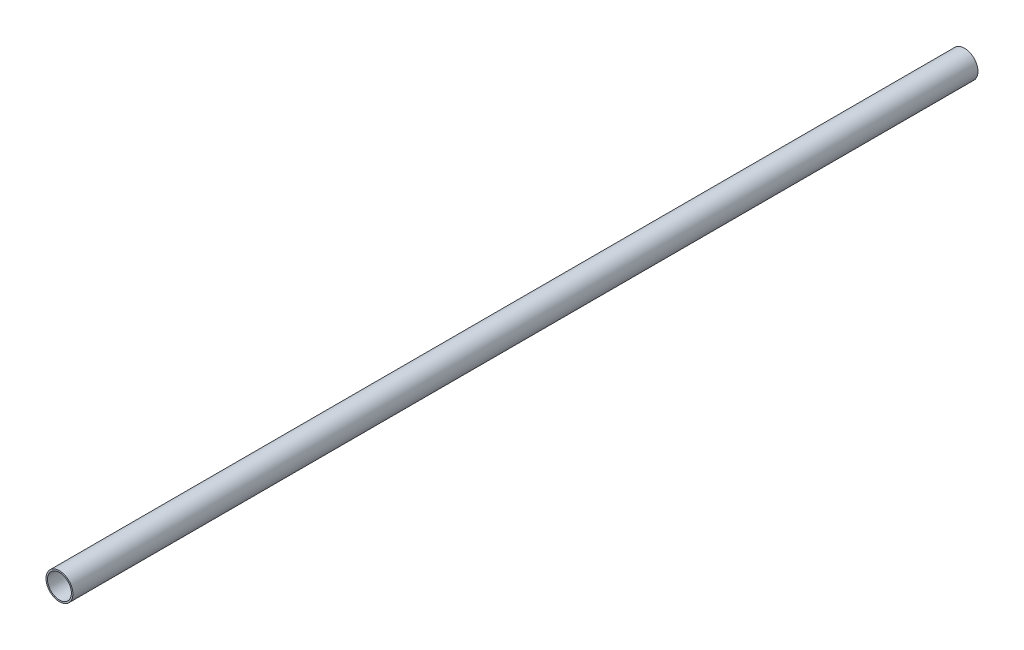
ISO-10303-21;
HEADER;
FILE_DESCRIPTION(('STEP AP214'),'2;1');
FILE_NAME('part.step','',(''),(''),'','','');
FILE_SCHEMA(('AUTOMOTIVE_DESIGN { 1 0 10303 214 1 1 1 1 }'));
ENDSEC;
DATA;
#1=APPLICATION_CONTEXT('core data for automotive mechanical design processes');
#2=APPLICATION_PROTOCOL_DEFINITION('international standard','automotive_design',2000,#1);
#3=PRODUCT_CONTEXT('',#1,'mechanical');
#4=PRODUCT('Part','Part','',(#3));
#5=PRODUCT_RELATED_PRODUCT_CATEGORY('part','',(#4));
#6=PRODUCT_DEFINITION_FORMATION('','',#4);
#7=PRODUCT_DEFINITION_CONTEXT('part definition',#1,'design');
#8=PRODUCT_DEFINITION('design','',#6,#7);
#9=PRODUCT_DEFINITION_SHAPE('','',#8);
#10=(LENGTH_UNIT() NAMED_UNIT(*) SI_UNIT(.MILLI.,.METRE.));
#11=(NAMED_UNIT(*) PLANE_ANGLE_UNIT() SI_UNIT($,.RADIAN.));
#12=(NAMED_UNIT(*) SI_UNIT($,.STERADIAN.) SOLID_ANGLE_UNIT());
#13=UNCERTAINTY_MEASURE_WITH_UNIT(LENGTH_MEASURE(1.E-05),#10,'distance_accuracy_value','');
#14=(GEOMETRIC_REPRESENTATION_CONTEXT(3) GLOBAL_UNCERTAINTY_ASSIGNED_CONTEXT((#13)) GLOBAL_UNIT_ASSIGNED_CONTEXT((#10,
#11,#12)) REPRESENTATION_CONTEXT('',''));
#15=CARTESIAN_POINT('',(0.,0.,0.));
#16=DIRECTION('',(0.,0.,1.));
#17=DIRECTION('',(1.,0.,0.));
#18=AXIS2_PLACEMENT_3D('',#15,#16,#17);
#19=CARTESIAN_POINT('',(0.,0.,266.7));
#20=DIRECTION('',(0.,0.,1.));
#21=DIRECTION('',(1.,0.,0.));
#22=AXIS2_PLACEMENT_3D('',#19,#20,#21);
#23=PLANE('',#22);
#24=CARTESIAN_POINT('',(0.,0.,266.7));
#25=DIRECTION('',(0.,0.,1.));
#26=DIRECTION('',(1.,0.,0.));
#27=AXIS2_PLACEMENT_3D('',#24,#25,#26);
#28=CIRCLE('',#27,7.9375);
#29=CARTESIAN_POINT('',(7.9375,0.,266.7));
#30=VERTEX_POINT('',#29);
#31=EDGE_CURVE('E10',#30,#30,#28,.T.);
#32=ORIENTED_EDGE('',*,*,#31,.T.);
#33=EDGE_LOOP('',(#32));
#34=FACE_BOUND('',#33,.T.);
#35=CARTESIAN_POINT('',(0.,0.,266.7));
#36=DIRECTION('',(0.,0.,1.));
#37=DIRECTION('',(1.,0.,0.));
#38=AXIS2_PLACEMENT_3D('',#35,#36,#37);
#39=CIRCLE('',#38,7.0485);
#40=CARTESIAN_POINT('',(7.0485,0.,266.7));
#41=VERTEX_POINT('',#40);
#42=EDGE_CURVE('E56',#41,#41,#39,.T.);
#43=ORIENTED_EDGE('',*,*,#42,.F.);
#44=EDGE_LOOP('',(#43));
#45=FACE_BOUND('',#44,.T.);
#46=ADVANCED_FACE('F43',(#34,#45),#23,.T.);
#47=CARTESIAN_POINT('',(0.,0.,-266.7));
#48=DIRECTION('',(0.,0.,1.));
#49=DIRECTION('',(1.,0.,0.));
#50=AXIS2_PLACEMENT_3D('',#47,#48,#49);
#51=PLANE('',#50);
#52=CARTESIAN_POINT('',(0.,0.,-266.7));
#53=DIRECTION('',(0.,0.,1.));
#54=DIRECTION('',(1.,0.,0.));
#55=AXIS2_PLACEMENT_3D('',#52,#53,#54);
#56=CIRCLE('',#55,7.9375);
#57=CARTESIAN_POINT('',(7.9375,0.,-266.7));
#58=VERTEX_POINT('',#57);
#59=EDGE_CURVE('E47',#58,#58,#56,.T.);
#60=ORIENTED_EDGE('',*,*,#59,.F.);
#61=EDGE_LOOP('',(#60));
#62=FACE_BOUND('',#61,.T.);
#63=CARTESIAN_POINT('',(0.,0.,-266.7));
#64=DIRECTION('',(0.,0.,1.));
#65=DIRECTION('',(1.,0.,0.));
#66=AXIS2_PLACEMENT_3D('',#63,#64,#65);
#67=CIRCLE('',#66,7.0485);
#68=CARTESIAN_POINT('',(7.0485,0.,-266.7));
#69=VERTEX_POINT('',#68);
#70=EDGE_CURVE('E58',#69,#69,#67,.T.);
#71=ORIENTED_EDGE('',*,*,#70,.T.);
#72=EDGE_LOOP('',(#71));
#73=FACE_BOUND('',#72,.T.);
#74=ADVANCED_FACE('F70',(#62,#73),#51,.F.);
#75=CARTESIAN_POINT('',(0.,0.,266.7));
#76=DIRECTION('',(0.,0.,-1.));
#77=DIRECTION('',(-1.,0.,0.));
#78=AXIS2_PLACEMENT_3D('',#75,#76,#77);
#79=CYLINDRICAL_SURFACE('',#78,7.9375);
#80=ORIENTED_EDGE('',*,*,#31,.F.);
#81=EDGE_LOOP('',(#80));
#82=FACE_BOUND('',#81,.T.);
#83=ORIENTED_EDGE('',*,*,#59,.T.);
#84=EDGE_LOOP('',(#83));
#85=FACE_BOUND('',#84,.T.);
#86=ADVANCED_FACE('F45',(#82,#85),#79,.T.);
#87=CARTESIAN_POINT('',(0.,0.,266.7));
#88=DIRECTION('',(0.,0.,-1.));
#89=DIRECTION('',(-1.,0.,0.));
#90=AXIS2_PLACEMENT_3D('',#87,#88,#89);
#91=CYLINDRICAL_SURFACE('',#90,7.0485);
#92=ORIENTED_EDGE('',*,*,#42,.T.);
#93=EDGE_LOOP('',(#92));
#94=FACE_BOUND('',#93,.T.);
#95=ORIENTED_EDGE('',*,*,#70,.F.);
#96=EDGE_LOOP('',(#95));
#97=FACE_BOUND('',#96,.T.);
#98=ADVANCED_FACE('F66',(#94,#97),#91,.F.);
#99=CLOSED_SHELL('',(#46,#74,#86,#98));
#100=MANIFOLD_SOLID_BREP('B2',#99);
#101=ADVANCED_BREP_SHAPE_REPRESENTATION('',(#18,#100),#14);
#102=SHAPE_DEFINITION_REPRESENTATION(#9,#101);
ENDSEC;
END-ISO-10303-21;
